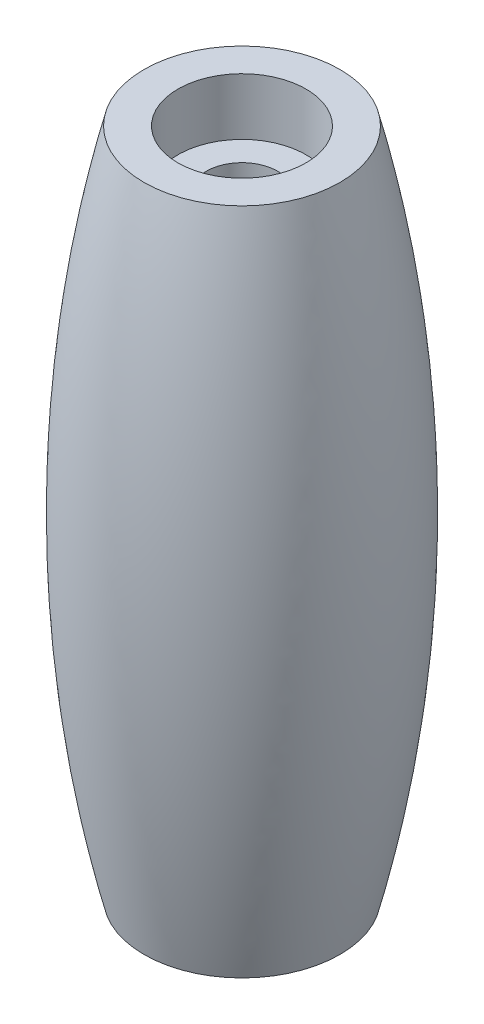
ISO-10303-21;
HEADER;
FILE_DESCRIPTION(('STEP AP214'),'2;1');
FILE_NAME('part.step','',(''),(''),'','','');
FILE_SCHEMA(('AUTOMOTIVE_DESIGN { 1 0 10303 214 1 1 1 1 }'));
ENDSEC;
DATA;
#1=APPLICATION_CONTEXT('core data for automotive mechanical design processes');
#2=APPLICATION_PROTOCOL_DEFINITION('international standard','automotive_design',2000,#1);
#3=PRODUCT_CONTEXT('',#1,'mechanical');
#4=PRODUCT('Part','Part','',(#3));
#5=PRODUCT_RELATED_PRODUCT_CATEGORY('part','',(#4));
#6=PRODUCT_DEFINITION_FORMATION('','',#4);
#7=PRODUCT_DEFINITION_CONTEXT('part definition',#1,'design');
#8=PRODUCT_DEFINITION('design','',#6,#7);
#9=PRODUCT_DEFINITION_SHAPE('','',#8);
#10=(LENGTH_UNIT() NAMED_UNIT(*) SI_UNIT(.MILLI.,.METRE.));
#11=(NAMED_UNIT(*) PLANE_ANGLE_UNIT() SI_UNIT($,.RADIAN.));
#12=(NAMED_UNIT(*) SI_UNIT($,.STERADIAN.) SOLID_ANGLE_UNIT());
#13=UNCERTAINTY_MEASURE_WITH_UNIT(LENGTH_MEASURE(1.E-05),#10,'distance_accuracy_value','');
#14=(GEOMETRIC_REPRESENTATION_CONTEXT(3) GLOBAL_UNCERTAINTY_ASSIGNED_CONTEXT((#13)) GLOBAL_UNIT_ASSIGNED_CONTEXT((#10,
#11,#12)) REPRESENTATION_CONTEXT('',''));
#15=CARTESIAN_POINT('',(0.,0.,0.));
#16=DIRECTION('',(0.,0.,1.));
#17=DIRECTION('',(1.,0.,0.));
#18=AXIS2_PLACEMENT_3D('',#15,#16,#17);
#19=CARTESIAN_POINT('',(0.,-23.5000000000001,0.));
#20=DIRECTION('',(0.,0.999999999999999,0.));
#21=DIRECTION('',(0.,0.,0.999999999999999));
#22=AXIS2_PLACEMENT_3D('',#19,#20,#21);
#23=CYLINDRICAL_SURFACE('',#22,4.5);
#24=CARTESIAN_POINT('',(0.,-23.5000000000001,0.));
#25=DIRECTION('',(0.,0.999999999999999,0.));
#26=DIRECTION('',(0.,0.,0.999999999999999));
#27=AXIS2_PLACEMENT_3D('',#24,#25,#26);
#28=CIRCLE('',#27,4.5);
#29=CARTESIAN_POINT('',(0.,-23.5000000000001,4.49999999999997));
#30=VERTEX_POINT('',#29);
#31=EDGE_CURVE('E47',#30,#30,#28,.T.);
#32=CARTESIAN_POINT('',(0.,-19.5,0.));
#33=DIRECTION('',(0.,0.999999999999999,0.));
#34=DIRECTION('',(0.,0.,0.999999999999999));
#35=AXIS2_PLACEMENT_3D('',#32,#33,#34);
#36=CIRCLE('',#35,4.5);
#37=CARTESIAN_POINT('',(0.,-19.5,4.49999999999997));
#38=VERTEX_POINT('',#37);
#39=EDGE_CURVE('E10',#38,#38,#36,.F.);
#40=CARTESIAN_POINT('',(0.,-23.5000000000001,4.49999999999997));
#41=CARTESIAN_POINT('',(0.,-23.4583333333334,4.49999999999997));
#42=CARTESIAN_POINT('',(0.,-23.4166666666667,4.49999999999997));
#43=CARTESIAN_POINT('',(0.,-23.3333333333334,4.49999999999997));
#44=CARTESIAN_POINT('',(0.,-23.2916666666667,4.49999999999997));
#45=CARTESIAN_POINT('',(0.,-23.2083333333334,4.49999999999997));
#46=CARTESIAN_POINT('',(0.,-23.1666666666667,4.49999999999997));
#47=CARTESIAN_POINT('',(0.,-23.0833333333334,4.49999999999997));
#48=CARTESIAN_POINT('',(0.,-23.0416666666667,4.49999999999997));
#49=CARTESIAN_POINT('',(0.,-22.9583333333334,4.49999999999997));
#50=CARTESIAN_POINT('',(0.,-22.9166666666667,4.49999999999997));
#51=CARTESIAN_POINT('',(0.,-22.8333333333334,4.49999999999997));
#52=CARTESIAN_POINT('',(0.,-22.7916666666667,4.49999999999997));
#53=CARTESIAN_POINT('',(0.,-22.7083333333334,4.49999999999997));
#54=CARTESIAN_POINT('',(0.,-22.6666666666667,4.49999999999997));
#55=CARTESIAN_POINT('',(0.,-22.5833333333334,4.49999999999997));
#56=CARTESIAN_POINT('',(0.,-22.5416666666667,4.49999999999997));
#57=CARTESIAN_POINT('',(0.,-22.4583333333334,4.49999999999997));
#58=CARTESIAN_POINT('',(0.,-22.4166666666667,4.49999999999997));
#59=CARTESIAN_POINT('',(0.,-22.3333333333334,4.49999999999997));
#60=CARTESIAN_POINT('',(0.,-22.2916666666667,4.49999999999997));
#61=CARTESIAN_POINT('',(0.,-22.2083333333334,4.49999999999997));
#62=CARTESIAN_POINT('',(0.,-22.1666666666667,4.49999999999997));
#63=CARTESIAN_POINT('',(0.,-22.0833333333334,4.49999999999997));
#64=CARTESIAN_POINT('',(0.,-22.0416666666667,4.49999999999997));
#65=CARTESIAN_POINT('',(0.,-21.9583333333334,4.49999999999997));
#66=CARTESIAN_POINT('',(0.,-21.9166666666667,4.49999999999997));
#67=CARTESIAN_POINT('',(0.,-21.8333333333334,4.49999999999997));
#68=CARTESIAN_POINT('',(0.,-21.7916666666667,4.49999999999997));
#69=CARTESIAN_POINT('',(0.,-21.7083333333334,4.49999999999997));
#70=CARTESIAN_POINT('',(0.,-21.6666666666667,4.49999999999997));
#71=CARTESIAN_POINT('',(0.,-21.5833333333334,4.49999999999997));
#72=CARTESIAN_POINT('',(0.,-21.5416666666667,4.49999999999997));
#73=CARTESIAN_POINT('',(0.,-21.4583333333334,4.49999999999997));
#74=CARTESIAN_POINT('',(0.,-21.4166666666667,4.49999999999997));
#75=CARTESIAN_POINT('',(0.,-21.3333333333334,4.49999999999997));
#76=CARTESIAN_POINT('',(0.,-21.2916666666667,4.49999999999997));
#77=CARTESIAN_POINT('',(0.,-21.2083333333334,4.49999999999997));
#78=CARTESIAN_POINT('',(0.,-21.1666666666667,4.49999999999997));
#79=CARTESIAN_POINT('',(0.,-21.0833333333334,4.49999999999997));
#80=CARTESIAN_POINT('',(0.,-21.0416666666667,4.49999999999997));
#81=CARTESIAN_POINT('',(0.,-20.9583333333334,4.49999999999997));
#82=CARTESIAN_POINT('',(0.,-20.9166666666667,4.49999999999997));
#83=CARTESIAN_POINT('',(0.,-20.8333333333334,4.49999999999997));
#84=CARTESIAN_POINT('',(0.,-20.7916666666667,4.49999999999997));
#85=CARTESIAN_POINT('',(0.,-20.7083333333334,4.49999999999997));
#86=CARTESIAN_POINT('',(0.,-20.6666666666667,4.49999999999997));
#87=CARTESIAN_POINT('',(0.,-20.5833333333334,4.49999999999997));
#88=CARTESIAN_POINT('',(0.,-20.5416666666667,4.49999999999997));
#89=CARTESIAN_POINT('',(0.,-20.4583333333334,4.49999999999997));
#90=CARTESIAN_POINT('',(0.,-20.4166666666667,4.49999999999997));
#91=CARTESIAN_POINT('',(0.,-20.3333333333334,4.49999999999997));
#92=CARTESIAN_POINT('',(0.,-20.2916666666667,4.49999999999997));
#93=CARTESIAN_POINT('',(0.,-20.2083333333334,4.49999999999997));
#94=CARTESIAN_POINT('',(0.,-20.1666666666667,4.49999999999997));
#95=CARTESIAN_POINT('',(0.,-20.0833333333334,4.49999999999997));
#96=CARTESIAN_POINT('',(0.,-20.0416666666667,4.49999999999997));
#97=CARTESIAN_POINT('',(0.,-19.9583333333334,4.49999999999997));
#98=CARTESIAN_POINT('',(0.,-19.9166666666667,4.49999999999997));
#99=CARTESIAN_POINT('',(0.,-19.8333333333334,4.49999999999997));
#100=CARTESIAN_POINT('',(0.,-19.7916666666667,4.49999999999997));
#101=CARTESIAN_POINT('',(0.,-19.7083333333334,4.49999999999997));
#102=CARTESIAN_POINT('',(0.,-19.6666666666667,4.49999999999997));
#103=CARTESIAN_POINT('',(0.,-19.5833333333334,4.49999999999997));
#104=CARTESIAN_POINT('',(0.,-19.5416666666667,4.49999999999997));
#105=CARTESIAN_POINT('',(0.,-19.5,4.49999999999997));
#106=B_SPLINE_CURVE_WITH_KNOTS('',3,(#40,#41,#42,#43,#44,#45,#46,#47,#48,#49,#50,#51,#52,#53,
#54,#55,#56,#57,#58,#59,#60,#61,#62,#63,#64,#65,#66,#67,#68,#69,#70,#71,#72,#73,#74,#75,#76,#77,
#78,#79,#80,#81,#82,#83,#84,#85,#86,#87,#88,#89,#90,#91,#92,#93,#94,#95,#96,#97,#98,#99,#100,
#101,#102,#103,#104,#105),.UNSPECIFIED.,.F.,.F.,(4,2,2,2,2,2,2,2,2,2,2,2,2,2,2,2,2,2,2,2,2,2,2,
2,2,2,2,2,2,2,2,2,4),(0.,0.125000000000004,0.250000000000004,0.375000000000004,
0.500000000000004,0.625000000000004,0.750000000000008,0.875000000000008,1.00000000000001,
1.12500000000001,1.25000000000001,1.37500000000001,1.50000000000001,1.62500000000001,
1.75000000000001,1.87500000000001,2.00000000000002,2.12500000000002,2.25000000000002,
2.37500000000002,2.50000000000002,2.62500000000002,2.75000000000002,2.87500000000002,
3.00000000000002,3.12500000000002,3.25000000000002,3.37500000000002,3.50000000000002,
3.62500000000002,3.75000000000002,3.87500000000002,4.00000000000003),.UNSPECIFIED.);
#107=EDGE_CURVE('BSEAM32',#30,#38,#106,.T.);
#108=ORIENTED_EDGE('',*,*,#31,.F.);
#109=ORIENTED_EDGE('',*,*,#39,.F.);
#110=ORIENTED_EDGE('',*,*,#107,.T.);
#111=ORIENTED_EDGE('',*,*,#107,.F.);
#112=EDGE_LOOP('',(#108,#110,#109,#111));
#113=FACE_BOUND('',#112,.T.);
#114=ADVANCED_FACE('F32',(#113),#23,.F.);
#115=CARTESIAN_POINT('',(0.,23.5,0.));
#116=DIRECTION('',(0.,0.999999999999999,0.));
#117=DIRECTION('',(0.,0.,0.999999999999999));
#118=AXIS2_PLACEMENT_3D('',#115,#116,#117);
#119=PLANE('',#118);
#120=CARTESIAN_POINT('',(0.,23.5,0.));
#121=DIRECTION('',(0.,0.999999999999999,0.));
#122=DIRECTION('',(0.,0.,0.999999999999999));
#123=AXIS2_PLACEMENT_3D('',#120,#121,#122);
#124=CIRCLE('',#123,4.5);
#125=CARTESIAN_POINT('',(0.,23.5,4.49999999999998));
#126=VERTEX_POINT('',#125);
#127=EDGE_CURVE('E52',#126,#126,#124,.T.);
#128=ORIENTED_EDGE('',*,*,#127,.F.);
#129=EDGE_LOOP('',(#128));
#130=FACE_BOUND('',#129,.T.);
#131=CARTESIAN_POINT('',(0.,23.4999999999999,0.));
#132=DIRECTION('',(0.,-0.999999999999999,0.));
#133=DIRECTION('',(0.,0.,-0.999999999999999));
#134=AXIS2_PLACEMENT_3D('',#131,#132,#133);
#135=CIRCLE('',#134,6.88297917638117);
#136=CARTESIAN_POINT('',(0.,23.4999999999999,-6.88297917638118));
#137=VERTEX_POINT('',#136);
#138=EDGE_CURVE('E39',#137,#137,#135,.T.);
#139=ORIENTED_EDGE('',*,*,#138,.F.);
#140=EDGE_LOOP('',(#139));
#141=FACE_BOUND('',#140,.T.);
#142=ADVANCED_FACE('F34',(#130,#141),#119,.T.);
#143=CARTESIAN_POINT('',(-40.275,0.,0.));
#144=DIRECTION('',(0.,0.,0.999999999999999));
#145=DIRECTION('',(0.,0.999999999999999,0.));
#146=AXIS2_PLACEMENT_3D('',#143,#144,#145);
#147=ELLIPSE('',#146,70.7106781186548,50.);
#148=TRIMMED_CURVE('',#147,(PARAMETER_VALUE(4.07811138408957)),
(PARAMETER_VALUE(5.34666657667981)),.T.,.PARAMETER.);
#149=CARTESIAN_POINT('',(0.,0.,0.));
#150=DIRECTION('',(0.,-0.999999999999999,0.));
#151=AXIS1_PLACEMENT('',#149,#150);
#152=SURFACE_OF_REVOLUTION('',#148,#151);
#153=ORIENTED_EDGE('',*,*,#138,.T.);
#154=EDGE_LOOP('',(#153));
#155=FACE_BOUND('',#154,.T.);
#156=CARTESIAN_POINT('',(0.,-23.5,0.));
#157=DIRECTION('',(0.,-0.999999999999999,0.));
#158=DIRECTION('',(0.,0.,-0.999999999999999));
#159=AXIS2_PLACEMENT_3D('',#156,#157,#158);
#160=CIRCLE('',#159,6.88297917638116);
#161=CARTESIAN_POINT('',(0.,-23.5000000000001,-6.88297917638115));
#162=VERTEX_POINT('',#161);
#163=EDGE_CURVE('E43',#162,#162,#160,.T.);
#164=ORIENTED_EDGE('',*,*,#163,.F.);
#165=EDGE_LOOP('',(#164));
#166=FACE_BOUND('',#165,.T.);
#167=ADVANCED_FACE('F54',(#155,#166),#152,.F.);
#168=CARTESIAN_POINT('',(0.,-23.5,0.));
#169=DIRECTION('',(0.,-0.999999999999999,0.));
#170=DIRECTION('',(0.,0.,-0.999999999999999));
#171=AXIS2_PLACEMENT_3D('',#168,#169,#170);
#172=PLANE('',#171);
#173=ORIENTED_EDGE('',*,*,#31,.T.);
#174=EDGE_LOOP('',(#173));
#175=FACE_BOUND('',#174,.T.);
#176=ORIENTED_EDGE('',*,*,#163,.T.);
#177=EDGE_LOOP('',(#176));
#178=FACE_BOUND('',#177,.T.);
#179=ADVANCED_FACE('F57',(#175,#178),#172,.T.);
#180=CARTESIAN_POINT('',(0.,19.5,0.));
#181=DIRECTION('',(0.,0.999999999999999,0.));
#182=DIRECTION('',(0.,0.,0.999999999999999));
#183=AXIS2_PLACEMENT_3D('',#180,#181,#182);
#184=CIRCLE('',#183,4.5);
#185=CARTESIAN_POINT('',(0.,19.5,4.49999999999998));
#186=VERTEX_POINT('',#185);
#187=EDGE_CURVE('E94',#186,#186,#184,.T.);
#188=CARTESIAN_POINT('',(0.,19.5,4.49999999999998));
#189=CARTESIAN_POINT('',(0.,19.5416666666666,4.49999999999998));
#190=CARTESIAN_POINT('',(0.,19.5833333333333,4.49999999999998));
#191=CARTESIAN_POINT('',(0.,19.6666666666666,4.49999999999998));
#192=CARTESIAN_POINT('',(0.,19.7083333333333,4.49999999999998));
#193=CARTESIAN_POINT('',(0.,19.7916666666666,4.49999999999998));
#194=CARTESIAN_POINT('',(0.,19.8333333333333,4.49999999999998));
#195=CARTESIAN_POINT('',(0.,19.9166666666666,4.49999999999998));
#196=CARTESIAN_POINT('',(0.,19.9583333333333,4.49999999999998));
#197=CARTESIAN_POINT('',(0.,20.0416666666666,4.49999999999998));
#198=CARTESIAN_POINT('',(0.,20.0833333333333,4.49999999999998));
#199=CARTESIAN_POINT('',(0.,20.1666666666666,4.49999999999998));
#200=CARTESIAN_POINT('',(0.,20.2083333333333,4.49999999999998));
#201=CARTESIAN_POINT('',(0.,20.2916666666666,4.49999999999998));
#202=CARTESIAN_POINT('',(0.,20.3333333333333,4.49999999999998));
#203=CARTESIAN_POINT('',(0.,20.4166666666666,4.49999999999998));
#204=CARTESIAN_POINT('',(0.,20.4583333333333,4.49999999999998));
#205=CARTESIAN_POINT('',(0.,20.5416666666666,4.49999999999998));
#206=CARTESIAN_POINT('',(0.,20.5833333333333,4.49999999999998));
#207=CARTESIAN_POINT('',(0.,20.6666666666666,4.49999999999998));
#208=CARTESIAN_POINT('',(0.,20.7083333333333,4.49999999999998));
#209=CARTESIAN_POINT('',(0.,20.7916666666666,4.49999999999998));
#210=CARTESIAN_POINT('',(0.,20.8333333333333,4.49999999999998));
#211=CARTESIAN_POINT('',(0.,20.9166666666666,4.49999999999998));
#212=CARTESIAN_POINT('',(0.,20.9583333333333,4.49999999999998));
#213=CARTESIAN_POINT('',(0.,21.0416666666666,4.49999999999998));
#214=CARTESIAN_POINT('',(0.,21.0833333333333,4.49999999999998));
#215=CARTESIAN_POINT('',(0.,21.1666666666666,4.49999999999998));
#216=CARTESIAN_POINT('',(0.,21.2083333333333,4.49999999999998));
#217=CARTESIAN_POINT('',(0.,21.2916666666666,4.49999999999998));
#218=CARTESIAN_POINT('',(0.,21.3333333333333,4.49999999999998));
#219=CARTESIAN_POINT('',(0.,21.4166666666666,4.49999999999998));
#220=CARTESIAN_POINT('',(0.,21.4583333333333,4.49999999999998));
#221=CARTESIAN_POINT('',(0.,21.5416666666666,4.49999999999998));
#222=CARTESIAN_POINT('',(0.,21.5833333333333,4.49999999999998));
#223=CARTESIAN_POINT('',(0.,21.6666666666666,4.49999999999998));
#224=CARTESIAN_POINT('',(0.,21.7083333333333,4.49999999999998));
#225=CARTESIAN_POINT('',(0.,21.7916666666666,4.49999999999998));
#226=CARTESIAN_POINT('',(0.,21.8333333333333,4.49999999999998));
#227=CARTESIAN_POINT('',(0.,21.9166666666666,4.49999999999998));
#228=CARTESIAN_POINT('',(0.,21.9583333333333,4.49999999999998));
#229=CARTESIAN_POINT('',(0.,22.0416666666666,4.49999999999998));
#230=CARTESIAN_POINT('',(0.,22.0833333333333,4.49999999999998));
#231=CARTESIAN_POINT('',(0.,22.1666666666666,4.49999999999998));
#232=CARTESIAN_POINT('',(0.,22.2083333333333,4.49999999999998));
#233=CARTESIAN_POINT('',(0.,22.2916666666666,4.49999999999998));
#234=CARTESIAN_POINT('',(0.,22.3333333333333,4.49999999999998));
#235=CARTESIAN_POINT('',(0.,22.4166666666666,4.49999999999998));
#236=CARTESIAN_POINT('',(0.,22.4583333333333,4.49999999999998));
#237=CARTESIAN_POINT('',(0.,22.5416666666666,4.49999999999998));
#238=CARTESIAN_POINT('',(0.,22.5833333333333,4.49999999999998));
#239=CARTESIAN_POINT('',(0.,22.6666666666666,4.49999999999998));
#240=CARTESIAN_POINT('',(0.,22.7083333333333,4.49999999999998));
#241=CARTESIAN_POINT('',(0.,22.7916666666666,4.49999999999998));
#242=CARTESIAN_POINT('',(0.,22.8333333333333,4.49999999999998));
#243=CARTESIAN_POINT('',(0.,22.9166666666666,4.49999999999998));
#244=CARTESIAN_POINT('',(0.,22.9583333333333,4.49999999999998));
#245=CARTESIAN_POINT('',(0.,23.0416666666666,4.49999999999998));
#246=CARTESIAN_POINT('',(0.,23.0833333333333,4.49999999999998));
#247=CARTESIAN_POINT('',(0.,23.1666666666666,4.49999999999998));
#248=CARTESIAN_POINT('',(0.,23.2083333333333,4.49999999999998));
#249=CARTESIAN_POINT('',(0.,23.2916666666666,4.49999999999998));
#250=CARTESIAN_POINT('',(0.,23.3333333333333,4.49999999999998));
#251=CARTESIAN_POINT('',(0.,23.4166666666666,4.49999999999998));
#252=CARTESIAN_POINT('',(0.,23.4583333333333,4.49999999999998));
#253=CARTESIAN_POINT('',(0.,23.5,4.49999999999998));
#254=B_SPLINE_CURVE_WITH_KNOTS('',3,(#188,#189,#190,#191,#192,#193,#194,#195,#196,#197,#198,
#199,#200,#201,#202,#203,#204,#205,#206,#207,#208,#209,#210,#211,#212,#213,#214,#215,#216,#217,
#218,#219,#220,#221,#222,#223,#224,#225,#226,#227,#228,#229,#230,#231,#232,#233,#234,#235,#236,
#237,#238,#239,#240,#241,#242,#243,#244,#245,#246,#247,#248,#249,#250,#251,#252,#253),
.UNSPECIFIED.,.F.,.F.,(4,2,2,2,2,2,2,2,2,2,2,2,2,2,2,2,2,2,2,2,2,2,2,2,2,2,2,2,2,2,2,2,4),(0.,
0.125,0.25,0.375,0.5,0.625000000000008,0.750000000000008,0.875000000000008,1.00000000000001,
1.12500000000001,1.25000000000001,1.37500000000001,1.50000000000002,1.62500000000002,
1.75000000000002,1.87500000000002,2.00000000000002,2.12500000000002,2.25000000000002,
2.37500000000002,2.50000000000002,2.62500000000002,2.75000000000002,2.87500000000002,
3.00000000000002,3.12500000000002,3.25000000000002,3.37500000000002,3.50000000000003,
3.62500000000003,3.75000000000003,3.87500000000002,4.00000000000002),.UNSPECIFIED.);
#255=EDGE_CURVE('BSEAM60',#186,#126,#254,.T.);
#256=ORIENTED_EDGE('',*,*,#187,.F.);
#257=ORIENTED_EDGE('',*,*,#127,.T.);
#258=ORIENTED_EDGE('',*,*,#255,.T.);
#259=ORIENTED_EDGE('',*,*,#255,.F.);
#260=EDGE_LOOP('',(#256,#258,#257,#259));
#261=FACE_BOUND('',#260,.T.);
#262=ADVANCED_FACE('F60',(#261),#23,.F.);
#263=CARTESIAN_POINT('',(0.,-19.5,0.));
#264=DIRECTION('',(0.,0.999999999999999,0.));
#265=DIRECTION('',(0.,0.,0.999999999999999));
#266=AXIS2_PLACEMENT_3D('',#263,#264,#265);
#267=PLANE('',#266);
#268=CARTESIAN_POINT('',(0.,-19.5,0.));
#269=DIRECTION('',(0.,0.999999999999999,0.));
#270=DIRECTION('',(0.,0.,0.999999999999999));
#271=AXIS2_PLACEMENT_3D('',#268,#269,#270);
#272=CIRCLE('',#271,2.5);
#273=CARTESIAN_POINT('',(0.,-19.5,2.49999999999996));
#274=VERTEX_POINT('',#273);
#275=EDGE_CURVE('E90',#274,#274,#272,.T.);
#276=ORIENTED_EDGE('',*,*,#275,.T.);
#277=EDGE_LOOP('',(#276));
#278=FACE_BOUND('',#277,.T.);
#279=ORIENTED_EDGE('',*,*,#39,.T.);
#280=EDGE_LOOP('',(#279));
#281=FACE_BOUND('',#280,.T.);
#282=ADVANCED_FACE('F64',(#278,#281),#267,.F.);
#283=CARTESIAN_POINT('',(0.,-19.5,0.));
#284=DIRECTION('',(0.,0.999999999999999,0.));
#285=DIRECTION('',(0.,0.,0.999999999999999));
#286=AXIS2_PLACEMENT_3D('',#283,#284,#285);
#287=CYLINDRICAL_SURFACE('',#286,2.5);
#288=CARTESIAN_POINT('',(0.,19.5,0.));
#289=DIRECTION('',(0.,0.999999999999999,0.));
#290=DIRECTION('',(0.,0.,0.999999999999999));
#291=AXIS2_PLACEMENT_3D('',#288,#289,#290);
#292=CIRCLE('',#291,2.5);
#293=CARTESIAN_POINT('',(0.,19.5,2.49999999999996));
#294=VERTEX_POINT('',#293);
#295=EDGE_CURVE('E96',#294,#294,#292,.T.);
#296=CARTESIAN_POINT('',(0.,-19.5,2.49999999999996));
#297=CARTESIAN_POINT('',(0.,-19.09375,2.49999999999996));
#298=CARTESIAN_POINT('',(0.,-18.6875,2.49999999999996));
#299=CARTESIAN_POINT('',(0.,-17.875,2.49999999999996));
#300=CARTESIAN_POINT('',(0.,-17.46875,2.49999999999996));
#301=CARTESIAN_POINT('',(0.,-16.65625,2.49999999999996));
#302=CARTESIAN_POINT('',(0.,-16.25,2.49999999999996));
#303=CARTESIAN_POINT('',(0.,-15.4375,2.49999999999996));
#304=CARTESIAN_POINT('',(0.,-15.03125,2.49999999999996));
#305=CARTESIAN_POINT('',(0.,-14.21875,2.49999999999996));
#306=CARTESIAN_POINT('',(0.,-13.8125,2.49999999999996));
#307=CARTESIAN_POINT('',(0.,-13.,2.49999999999996));
#308=CARTESIAN_POINT('',(0.,-12.59375,2.49999999999996));
#309=CARTESIAN_POINT('',(0.,-11.78125,2.49999999999996));
#310=CARTESIAN_POINT('',(0.,-11.375,2.49999999999996));
#311=CARTESIAN_POINT('',(0.,-10.5625,2.49999999999996));
#312=CARTESIAN_POINT('',(0.,-10.15625,2.49999999999996));
#313=CARTESIAN_POINT('',(0.,-9.34375000000005,2.49999999999996));
#314=CARTESIAN_POINT('',(0.,-8.93750000000005,2.49999999999996));
#315=CARTESIAN_POINT('',(0.,-8.12500000000005,2.49999999999996));
#316=CARTESIAN_POINT('',(0.,-7.71875000000005,2.49999999999996));
#317=CARTESIAN_POINT('',(0.,-6.90625000000005,2.49999999999996));
#318=CARTESIAN_POINT('',(0.,-6.50000000000005,2.49999999999996));
#319=CARTESIAN_POINT('',(0.,-5.68750000000005,2.49999999999996));
#320=CARTESIAN_POINT('',(0.,-5.28125000000005,2.49999999999996));
#321=CARTESIAN_POINT('',(0.,-4.46875000000005,2.49999999999996));
#322=CARTESIAN_POINT('',(0.,-4.06250000000005,2.49999999999996));
#323=CARTESIAN_POINT('',(0.,-3.25000000000004,2.49999999999996));
#324=CARTESIAN_POINT('',(0.,-2.84375000000004,2.49999999999996));
#325=CARTESIAN_POINT('',(0.,-2.03125000000004,2.49999999999996));
#326=CARTESIAN_POINT('',(0.,-1.62500000000005,2.49999999999996));
#327=CARTESIAN_POINT('',(0.,-0.812500000000046,2.49999999999996));
#328=CARTESIAN_POINT('',(0.,-0.406250000000045,2.49999999999996));
#329=CARTESIAN_POINT('',(0.,0.406249999999955,2.49999999999996));
#330=CARTESIAN_POINT('',(0.,0.812499999999956,2.49999999999996));
#331=CARTESIAN_POINT('',(0.,1.62499999999996,2.49999999999996));
#332=CARTESIAN_POINT('',(0.,2.03124999999996,2.49999999999996));
#333=CARTESIAN_POINT('',(0.,2.84374999999996,2.49999999999996));
#334=CARTESIAN_POINT('',(0.,3.24999999999996,2.49999999999996));
#335=CARTESIAN_POINT('',(0.,4.06249999999996,2.49999999999996));
#336=CARTESIAN_POINT('',(0.,4.46874999999996,2.49999999999996));
#337=CARTESIAN_POINT('',(0.,5.28124999999996,2.49999999999996));
#338=CARTESIAN_POINT('',(0.,5.68749999999996,2.49999999999996));
#339=CARTESIAN_POINT('',(0.,6.49999999999996,2.49999999999996));
#340=CARTESIAN_POINT('',(0.,6.90624999999996,2.49999999999996));
#341=CARTESIAN_POINT('',(0.,7.71874999999996,2.49999999999996));
#342=CARTESIAN_POINT('',(0.,8.12499999999996,2.49999999999996));
#343=CARTESIAN_POINT('',(0.,8.93749999999996,2.49999999999996));
#344=CARTESIAN_POINT('',(0.,9.34374999999996,2.49999999999996));
#345=CARTESIAN_POINT('',(0.,10.15625,2.49999999999996));
#346=CARTESIAN_POINT('',(0.,10.5625,2.49999999999996));
#347=CARTESIAN_POINT('',(0.,11.375,2.49999999999996));
#348=CARTESIAN_POINT('',(0.,11.78125,2.49999999999996));
#349=CARTESIAN_POINT('',(0.,12.59375,2.49999999999996));
#350=CARTESIAN_POINT('',(0.,13.,2.49999999999996));
#351=CARTESIAN_POINT('',(0.,13.8125,2.49999999999996));
#352=CARTESIAN_POINT('',(0.,14.21875,2.49999999999996));
#353=CARTESIAN_POINT('',(0.,15.03125,2.49999999999996));
#354=CARTESIAN_POINT('',(0.,15.4375,2.49999999999996));
#355=CARTESIAN_POINT('',(0.,16.25,2.49999999999996));
#356=CARTESIAN_POINT('',(0.,16.65625,2.49999999999996));
#357=CARTESIAN_POINT('',(0.,17.46875,2.49999999999996));
#358=CARTESIAN_POINT('',(0.,17.875,2.49999999999996));
#359=CARTESIAN_POINT('',(0.,18.6875,2.49999999999996));
#360=CARTESIAN_POINT('',(0.,19.09375,2.49999999999996));
#361=CARTESIAN_POINT('',(0.,19.5,2.49999999999996));
#362=B_SPLINE_CURVE_WITH_KNOTS('',3,(#296,#297,#298,#299,#300,#301,#302,#303,#304,#305,#306,
#307,#308,#309,#310,#311,#312,#313,#314,#315,#316,#317,#318,#319,#320,#321,#322,#323,#324,#325,
#326,#327,#328,#329,#330,#331,#332,#333,#334,#335,#336,#337,#338,#339,#340,#341,#342,#343,#344,
#345,#346,#347,#348,#349,#350,#351,#352,#353,#354,#355,#356,#357,#358,#359,#360,#361),
.UNSPECIFIED.,.F.,.F.,(4,2,2,2,2,2,2,2,2,2,2,2,2,2,2,2,2,2,2,2,2,2,2,2,2,2,2,2,2,2,2,2,4),(0.,
1.21875,2.4375,3.65625,4.875,6.09375,7.3125,8.53125,9.75,10.96875,12.1875,13.40625,14.625,
15.84375,17.0625,18.28125,19.5,20.71875,21.9375,23.15625,24.375,25.59375,26.8125,28.03125,29.25,
30.46875,31.6875,32.90625,34.125,35.34375,36.5625,37.78125,39.),.UNSPECIFIED.);
#363=EDGE_CURVE('BSEAM68',#274,#294,#362,.T.);
#364=ORIENTED_EDGE('',*,*,#275,.F.);
#365=ORIENTED_EDGE('',*,*,#295,.T.);
#366=ORIENTED_EDGE('',*,*,#363,.T.);
#367=ORIENTED_EDGE('',*,*,#363,.F.);
#368=EDGE_LOOP('',(#364,#366,#365,#367));
#369=FACE_BOUND('',#368,.T.);
#370=ADVANCED_FACE('F68',(#369),#287,.F.);
#371=CARTESIAN_POINT('',(0.,19.5,0.));
#372=DIRECTION('',(0.,0.999999999999999,0.));
#373=DIRECTION('',(0.,0.,0.999999999999999));
#374=AXIS2_PLACEMENT_3D('',#371,#372,#373);
#375=PLANE('',#374);
#376=ORIENTED_EDGE('',*,*,#187,.T.);
#377=EDGE_LOOP('',(#376));
#378=FACE_BOUND('',#377,.T.);
#379=ORIENTED_EDGE('',*,*,#295,.F.);
#380=EDGE_LOOP('',(#379));
#381=FACE_BOUND('',#380,.T.);
#382=ADVANCED_FACE('F72',(#378,#381),#375,.T.);
#383=CLOSED_SHELL('',(#114,#142,#167,#179,#262,#282,#370,#382));
#384=MANIFOLD_SOLID_BREP('B2',#383);
#385=ADVANCED_BREP_SHAPE_REPRESENTATION('',(#18,#384),#14);
#386=SHAPE_DEFINITION_REPRESENTATION(#9,#385);
ENDSEC;
END-ISO-10303-21;
